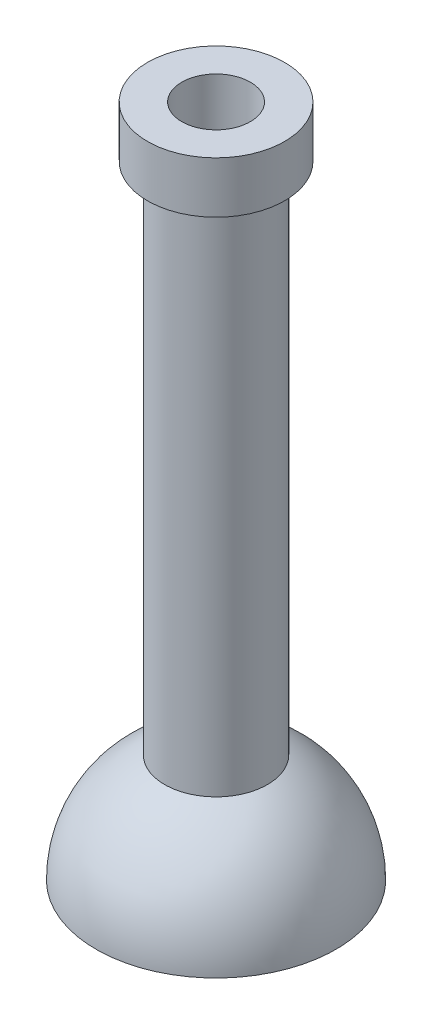
ISO-10303-21;
HEADER;
FILE_DESCRIPTION(('STEP AP214'),'2;1');
FILE_NAME('part.step','',(''),(''),'','','');
FILE_SCHEMA(('AUTOMOTIVE_DESIGN { 1 0 10303 214 1 1 1 1 }'));
ENDSEC;
DATA;
#1=APPLICATION_CONTEXT('core data for automotive mechanical design processes');
#2=APPLICATION_PROTOCOL_DEFINITION('international standard','automotive_design',2000,#1);
#3=PRODUCT_CONTEXT('',#1,'mechanical');
#4=PRODUCT('Part','Part','',(#3));
#5=PRODUCT_RELATED_PRODUCT_CATEGORY('part','',(#4));
#6=PRODUCT_DEFINITION_FORMATION('','',#4);
#7=PRODUCT_DEFINITION_CONTEXT('part definition',#1,'design');
#8=PRODUCT_DEFINITION('design','',#6,#7);
#9=PRODUCT_DEFINITION_SHAPE('','',#8);
#10=(LENGTH_UNIT() NAMED_UNIT(*) SI_UNIT(.MILLI.,.METRE.));
#11=(NAMED_UNIT(*) PLANE_ANGLE_UNIT() SI_UNIT($,.RADIAN.));
#12=(NAMED_UNIT(*) SI_UNIT($,.STERADIAN.) SOLID_ANGLE_UNIT());
#13=UNCERTAINTY_MEASURE_WITH_UNIT(LENGTH_MEASURE(1.E-05),#10,'distance_accuracy_value','');
#14=(GEOMETRIC_REPRESENTATION_CONTEXT(3) GLOBAL_UNCERTAINTY_ASSIGNED_CONTEXT((#13)) GLOBAL_UNIT_ASSIGNED_CONTEXT((#10,
#11,#12)) REPRESENTATION_CONTEXT('',''));
#15=CARTESIAN_POINT('',(0.,0.,0.));
#16=DIRECTION('',(0.,0.,1.));
#17=DIRECTION('',(1.,0.,0.));
#18=AXIS2_PLACEMENT_3D('',#15,#16,#17);
#19=CARTESIAN_POINT('',(0.,-39.3245553203368,0.));
#20=DIRECTION('',(0.,1.,0.));
#21=DIRECTION('',(1.,0.,0.));
#22=AXIS2_PLACEMENT_3D('',#19,#20,#21);
#23=SPHERICAL_SURFACE('',#22,5.);
#24=CARTESIAN_POINT('',(0.,-34.7419796253809,0.));
#25=DIRECTION('',(0.,-1.,0.));
#26=DIRECTION('',(1.,0.,0.));
#27=AXIS2_PLACEMENT_3D('',#24,#25,#26);
#28=CIRCLE('',#27,2.);
#29=CARTESIAN_POINT('',(2.,-34.7419796253809,0.));
#30=VERTEX_POINT('',#29);
#31=EDGE_CURVE('E70',#30,#30,#28,.T.);
#32=ORIENTED_EDGE('',*,*,#31,.F.);
#33=EDGE_LOOP('',(#32));
#34=FACE_BOUND('',#33,.T.);
#35=CARTESIAN_POINT('',(0.,-39.3245553203368,0.));
#36=DIRECTION('',(0.,1.,0.));
#37=DIRECTION('',(-1.,0.,0.));
#38=AXIS2_PLACEMENT_3D('',#35,#36,#37);
#39=CIRCLE('',#38,5.);
#40=CARTESIAN_POINT('',(-4.99999999999999,-39.3245553203368,0.));
#41=VERTEX_POINT('',#40);
#42=EDGE_CURVE('E10',#41,#41,#39,.T.);
#43=ORIENTED_EDGE('',*,*,#42,.F.);
#44=EDGE_LOOP('',(#43));
#45=FACE_BOUND('',#44,.T.);
#46=ADVANCED_FACE('F39',(#34,#45),#23,.F.);
#47=CARTESIAN_POINT('',(0.,-39.3245553203368,0.));
#48=DIRECTION('',(0.,1.,0.));
#49=DIRECTION('',(-1.,0.,0.));
#50=AXIS2_PLACEMENT_3D('',#47,#48,#49);
#51=PLANE('',#50);
#52=CARTESIAN_POINT('',(0.,-39.3245553203368,0.));
#53=DIRECTION('',(0.,1.,0.));
#54=DIRECTION('',(-1.,0.,0.));
#55=AXIS2_PLACEMENT_3D('',#52,#53,#54);
#56=CIRCLE('',#55,7.);
#57=CARTESIAN_POINT('',(-6.99999999999999,-39.3245553203368,0.));
#58=VERTEX_POINT('',#57);
#59=EDGE_CURVE('E46',#58,#58,#56,.T.);
#60=ORIENTED_EDGE('',*,*,#59,.F.);
#61=EDGE_LOOP('',(#60));
#62=FACE_BOUND('',#61,.T.);
#63=ORIENTED_EDGE('',*,*,#42,.T.);
#64=EDGE_LOOP('',(#63));
#65=FACE_BOUND('',#64,.T.);
#66=ADVANCED_FACE('F99',(#62,#65),#51,.F.);
#67=CARTESIAN_POINT('',(0.,-39.3245553203368,0.));
#68=DIRECTION('',(0.,1.,0.));
#69=DIRECTION('',(1.,0.,0.));
#70=AXIS2_PLACEMENT_3D('',#67,#68,#69);
#71=SPHERICAL_SURFACE('',#70,7.);
#72=CARTESIAN_POINT('',(0.,-33.,0.));
#73=DIRECTION('',(0.,1.,0.));
#74=DIRECTION('',(-1.,0.,0.));
#75=AXIS2_PLACEMENT_3D('',#72,#73,#74);
#76=CIRCLE('',#75,3.);
#77=CARTESIAN_POINT('',(-3.,-33.,0.));
#78=VERTEX_POINT('',#77);
#79=EDGE_CURVE('E51',#78,#78,#76,.T.);
#80=ORIENTED_EDGE('',*,*,#79,.F.);
#81=EDGE_LOOP('',(#80));
#82=FACE_BOUND('',#81,.T.);
#83=ORIENTED_EDGE('',*,*,#59,.T.);
#84=EDGE_LOOP('',(#83));
#85=FACE_BOUND('',#84,.T.);
#86=ADVANCED_FACE('F104',(#82,#85),#71,.T.);
#87=CARTESIAN_POINT('',(0.,0.,0.));
#88=DIRECTION('',(0.,1.,0.));
#89=DIRECTION('',(-1.,0.,0.));
#90=AXIS2_PLACEMENT_3D('',#87,#88,#89);
#91=CYLINDRICAL_SURFACE('',#90,3.);
#92=ORIENTED_EDGE('',*,*,#79,.T.);
#93=EDGE_LOOP('',(#92));
#94=FACE_BOUND('',#93,.T.);
#95=CARTESIAN_POINT('',(0.,-3.,0.));
#96=DIRECTION('',(0.,1.,0.));
#97=DIRECTION('',(-1.,0.,0.));
#98=AXIS2_PLACEMENT_3D('',#95,#96,#97);
#99=CIRCLE('',#98,3.);
#100=CARTESIAN_POINT('',(-3.,-3.,0.));
#101=VERTEX_POINT('',#100);
#102=EDGE_CURVE('E56',#101,#101,#99,.T.);
#103=ORIENTED_EDGE('',*,*,#102,.F.);
#104=EDGE_LOOP('',(#103));
#105=FACE_BOUND('',#104,.T.);
#106=ADVANCED_FACE('F95',(#94,#105),#91,.T.);
#107=CARTESIAN_POINT('',(0.,-3.,0.));
#108=DIRECTION('',(0.,-1.,0.));
#109=DIRECTION('',(1.,0.,0.));
#110=AXIS2_PLACEMENT_3D('',#107,#108,#109);
#111=PLANE('',#110);
#112=ORIENTED_EDGE('',*,*,#102,.T.);
#113=EDGE_LOOP('',(#112));
#114=FACE_BOUND('',#113,.T.);
#115=CARTESIAN_POINT('',(0.,-3.,0.));
#116=DIRECTION('',(0.,1.,0.));
#117=DIRECTION('',(-1.,0.,0.));
#118=AXIS2_PLACEMENT_3D('',#115,#116,#117);
#119=CIRCLE('',#118,4.);
#120=CARTESIAN_POINT('',(-4.,-3.,0.));
#121=VERTEX_POINT('',#120);
#122=EDGE_CURVE('E62',#121,#121,#119,.T.);
#123=ORIENTED_EDGE('',*,*,#122,.F.);
#124=EDGE_LOOP('',(#123));
#125=FACE_BOUND('',#124,.T.);
#126=ADVANCED_FACE('F89',(#114,#125),#111,.T.);
#127=CARTESIAN_POINT('',(0.,0.,0.));
#128=DIRECTION('',(0.,1.,0.));
#129=DIRECTION('',(-1.,0.,0.));
#130=AXIS2_PLACEMENT_3D('',#127,#128,#129);
#131=CYLINDRICAL_SURFACE('',#130,4.);
#132=ORIENTED_EDGE('',*,*,#122,.T.);
#133=EDGE_LOOP('',(#132));
#134=FACE_BOUND('',#133,.T.);
#135=CARTESIAN_POINT('',(0.,0.,0.));
#136=DIRECTION('',(0.,1.,0.));
#137=DIRECTION('',(-1.,0.,0.));
#138=AXIS2_PLACEMENT_3D('',#135,#136,#137);
#139=CIRCLE('',#138,4.);
#140=CARTESIAN_POINT('',(-4.,0.,0.));
#141=VERTEX_POINT('',#140);
#142=EDGE_CURVE('E66',#141,#141,#139,.T.);
#143=ORIENTED_EDGE('',*,*,#142,.F.);
#144=EDGE_LOOP('',(#143));
#145=FACE_BOUND('',#144,.T.);
#146=ADVANCED_FACE('F84',(#134,#145),#131,.T.);
#147=CARTESIAN_POINT('',(0.,0.,0.));
#148=DIRECTION('',(0.,1.,0.));
#149=DIRECTION('',(-1.,0.,0.));
#150=AXIS2_PLACEMENT_3D('',#147,#148,#149);
#151=PLANE('',#150);
#152=CARTESIAN_POINT('',(0.,0.,0.));
#153=DIRECTION('',(0.,1.,0.));
#154=DIRECTION('',(-1.,0.,0.));
#155=AXIS2_PLACEMENT_3D('',#152,#153,#154);
#156=CIRCLE('',#155,2.);
#157=CARTESIAN_POINT('',(-2.,0.,0.));
#158=VERTEX_POINT('',#157);
#159=EDGE_CURVE('E74',#158,#158,#156,.T.);
#160=ORIENTED_EDGE('',*,*,#159,.F.);
#161=EDGE_LOOP('',(#160));
#162=FACE_BOUND('',#161,.T.);
#163=ORIENTED_EDGE('',*,*,#142,.T.);
#164=EDGE_LOOP('',(#163));
#165=FACE_BOUND('',#164,.T.);
#166=ADVANCED_FACE('F81',(#162,#165),#151,.T.);
#167=CARTESIAN_POINT('',(0.,-39.3245553203368,0.));
#168=DIRECTION('',(0.,1.,0.));
#169=DIRECTION('',(-1.,0.,0.));
#170=AXIS2_PLACEMENT_3D('',#167,#168,#169);
#171=CYLINDRICAL_SURFACE('',#170,2.);
#172=ORIENTED_EDGE('',*,*,#31,.T.);
#173=EDGE_LOOP('',(#172));
#174=FACE_BOUND('',#173,.T.);
#175=ORIENTED_EDGE('',*,*,#159,.T.);
#176=EDGE_LOOP('',(#175));
#177=FACE_BOUND('',#176,.T.);
#178=ADVANCED_FACE('F79',(#174,#177),#171,.F.);
#179=CLOSED_SHELL('',(#46,#66,#86,#106,#126,#146,#166,#178));
#180=MANIFOLD_SOLID_BREP('B2',#179);
#181=ADVANCED_BREP_SHAPE_REPRESENTATION('',(#18,#180),#14);
#182=SHAPE_DEFINITION_REPRESENTATION(#9,#181);
ENDSEC;
END-ISO-10303-21;
